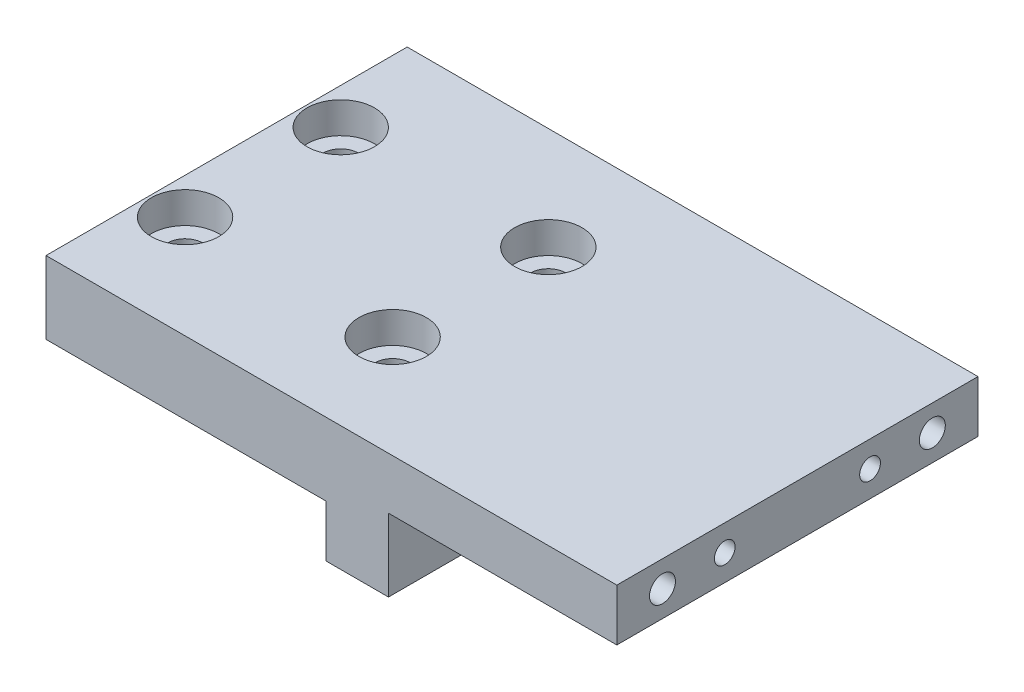
ISO-10303-21;
HEADER;
FILE_DESCRIPTION(('STEP AP214'),'2;1');
FILE_NAME('part.step','',(''),(''),'','','');
FILE_SCHEMA(('AUTOMOTIVE_DESIGN { 1 0 10303 214 1 1 1 1 }'));
ENDSEC;
DATA;
#1=APPLICATION_CONTEXT('core data for automotive mechanical design processes');
#2=APPLICATION_PROTOCOL_DEFINITION('international standard','automotive_design',2000,#1);
#3=PRODUCT_CONTEXT('',#1,'mechanical');
#4=PRODUCT('Part','Part','',(#3));
#5=PRODUCT_RELATED_PRODUCT_CATEGORY('part','',(#4));
#6=PRODUCT_DEFINITION_FORMATION('','',#4);
#7=PRODUCT_DEFINITION_CONTEXT('part definition',#1,'design');
#8=PRODUCT_DEFINITION('design','',#6,#7);
#9=PRODUCT_DEFINITION_SHAPE('','',#8);
#10=(LENGTH_UNIT() NAMED_UNIT(*) SI_UNIT(.MILLI.,.METRE.));
#11=(NAMED_UNIT(*) PLANE_ANGLE_UNIT() SI_UNIT($,.RADIAN.));
#12=(NAMED_UNIT(*) SI_UNIT($,.STERADIAN.) SOLID_ANGLE_UNIT());
#13=UNCERTAINTY_MEASURE_WITH_UNIT(LENGTH_MEASURE(1.E-05),#10,'distance_accuracy_value','');
#14=(GEOMETRIC_REPRESENTATION_CONTEXT(3) GLOBAL_UNCERTAINTY_ASSIGNED_CONTEXT((#13)) GLOBAL_UNIT_ASSIGNED_CONTEXT((#10,
#11,#12)) REPRESENTATION_CONTEXT('',''));
#15=CARTESIAN_POINT('',(0.,0.,0.));
#16=DIRECTION('',(0.,0.,1.));
#17=DIRECTION('',(1.,0.,0.));
#18=AXIS2_PLACEMENT_3D('',#15,#16,#17);
#19=CARTESIAN_POINT('',(3.5,-5.00100000000001,-24.9));
#20=DIRECTION('',(0.,1.,0.));
#21=DIRECTION('',(-1.,0.,0.));
#22=AXIS2_PLACEMENT_3D('',#19,#20,#21);
#23=CYLINDRICAL_SURFACE('',#22,1.7);
#24=CARTESIAN_POINT('',(3.5,0.,-24.9));
#25=DIRECTION('',(0.,-1.,0.));
#26=DIRECTION('',(0.,0.,-1.));
#27=AXIS2_PLACEMENT_3D('',#24,#25,#26);
#28=CIRCLE('',#27,1.7);
#29=CARTESIAN_POINT('',(3.5,0.,-26.6));
#30=VERTEX_POINT('',#29);
#31=EDGE_CURVE('E149',#30,#30,#28,.F.);
#32=ORIENTED_EDGE('',*,*,#31,.F.);
#33=EDGE_LOOP('',(#32));
#34=FACE_BOUND('',#33,.T.);
#35=CARTESIAN_POINT('',(3.5,4.,-24.9));
#36=DIRECTION('',(0.,1.,0.));
#37=DIRECTION('',(-1.,0.,0.));
#38=AXIS2_PLACEMENT_3D('',#35,#36,#37);
#39=CIRCLE('',#38,1.7);
#40=CARTESIAN_POINT('',(1.8,4.,-24.9));
#41=VERTEX_POINT('',#40);
#42=EDGE_CURVE('E43',#41,#41,#39,.F.);
#43=ORIENTED_EDGE('',*,*,#42,.F.);
#44=EDGE_LOOP('',(#43));
#45=FACE_BOUND('',#44,.T.);
#46=ADVANCED_FACE('F39',(#34,#45),#23,.F.);
#47=CARTESIAN_POINT('',(23.5,-5.00100000000001,-24.9));
#48=DIRECTION('',(0.,1.,0.));
#49=DIRECTION('',(-1.,0.,0.));
#50=AXIS2_PLACEMENT_3D('',#47,#48,#49);
#51=CYLINDRICAL_SURFACE('',#50,1.7);
#52=CARTESIAN_POINT('',(23.5,0.,-24.9));
#53=DIRECTION('',(0.,-1.,0.));
#54=DIRECTION('',(0.,0.,-1.));
#55=AXIS2_PLACEMENT_3D('',#52,#53,#54);
#56=CIRCLE('',#55,1.7);
#57=CARTESIAN_POINT('',(23.5,0.,-26.6));
#58=VERTEX_POINT('',#57);
#59=EDGE_CURVE('E254',#58,#58,#56,.F.);
#60=ORIENTED_EDGE('',*,*,#59,.F.);
#61=EDGE_LOOP('',(#60));
#62=FACE_BOUND('',#61,.T.);
#63=CARTESIAN_POINT('',(23.5,4.,-24.9));
#64=DIRECTION('',(0.,1.,0.));
#65=DIRECTION('',(-1.,0.,0.));
#66=AXIS2_PLACEMENT_3D('',#63,#64,#65);
#67=CIRCLE('',#66,1.7);
#68=CARTESIAN_POINT('',(21.8,4.,-24.9));
#69=VERTEX_POINT('',#68);
#70=EDGE_CURVE('E198',#69,#69,#67,.F.);
#71=ORIENTED_EDGE('',*,*,#70,.F.);
#72=EDGE_LOOP('',(#71));
#73=FACE_BOUND('',#72,.T.);
#74=ADVANCED_FACE('F305',(#62,#73),#51,.F.);
#75=CARTESIAN_POINT('',(23.5000000000002,-5.00100000000001,-9.9));
#76=DIRECTION('',(0.,1.,0.));
#77=DIRECTION('',(-1.,0.,0.));
#78=AXIS2_PLACEMENT_3D('',#75,#76,#77);
#79=CYLINDRICAL_SURFACE('',#78,1.7);
#80=CARTESIAN_POINT('',(23.5000000000002,0.,-9.9));
#81=DIRECTION('',(0.,-1.,0.));
#82=DIRECTION('',(0.,0.,-1.));
#83=AXIS2_PLACEMENT_3D('',#80,#81,#82);
#84=CIRCLE('',#83,1.7);
#85=CARTESIAN_POINT('',(23.5000000000002,0.,-11.6));
#86=VERTEX_POINT('',#85);
#87=EDGE_CURVE('E258',#86,#86,#84,.F.);
#88=ORIENTED_EDGE('',*,*,#87,.F.);
#89=EDGE_LOOP('',(#88));
#90=FACE_BOUND('',#89,.T.);
#91=CARTESIAN_POINT('',(23.5000000000002,4.,-9.9));
#92=DIRECTION('',(0.,1.,0.));
#93=DIRECTION('',(-1.,0.,0.));
#94=AXIS2_PLACEMENT_3D('',#91,#92,#93);
#95=CIRCLE('',#94,1.7);
#96=CARTESIAN_POINT('',(21.8000000000002,4.,-9.9));
#97=VERTEX_POINT('',#96);
#98=EDGE_CURVE('E194',#97,#97,#95,.F.);
#99=ORIENTED_EDGE('',*,*,#98,.F.);
#100=EDGE_LOOP('',(#99));
#101=FACE_BOUND('',#100,.T.);
#102=ADVANCED_FACE('F311',(#90,#101),#79,.F.);
#103=CARTESIAN_POINT('',(3.50000000000016,-5.00100000000001,-9.9));
#104=DIRECTION('',(0.,1.,0.));
#105=DIRECTION('',(-1.,0.,0.));
#106=AXIS2_PLACEMENT_3D('',#103,#104,#105);
#107=CYLINDRICAL_SURFACE('',#106,1.7);
#108=CARTESIAN_POINT('',(3.50000000000016,0.,-9.9));
#109=DIRECTION('',(0.,-1.,0.));
#110=DIRECTION('',(0.,0.,-1.));
#111=AXIS2_PLACEMENT_3D('',#108,#109,#110);
#112=CIRCLE('',#111,1.7);
#113=CARTESIAN_POINT('',(3.50000000000016,0.,-11.6));
#114=VERTEX_POINT('',#113);
#115=EDGE_CURVE('E247',#114,#114,#112,.F.);
#116=ORIENTED_EDGE('',*,*,#115,.F.);
#117=EDGE_LOOP('',(#116));
#118=FACE_BOUND('',#117,.T.);
#119=CARTESIAN_POINT('',(3.50000000000016,4.,-9.9));
#120=DIRECTION('',(0.,1.,0.));
#121=DIRECTION('',(-1.,0.,0.));
#122=AXIS2_PLACEMENT_3D('',#119,#120,#121);
#123=CIRCLE('',#122,1.7);
#124=CARTESIAN_POINT('',(1.80000000000016,4.,-9.9));
#125=VERTEX_POINT('',#124);
#126=EDGE_CURVE('E190',#125,#125,#123,.F.);
#127=ORIENTED_EDGE('',*,*,#126,.F.);
#128=EDGE_LOOP('',(#127));
#129=FACE_BOUND('',#128,.T.);
#130=ADVANCED_FACE('F300',(#118,#129),#107,.F.);
#131=CARTESIAN_POINT('',(0.,6.99999999999999,-34.8));
#132=DIRECTION('',(-1.,0.,0.));
#133=DIRECTION('',(0.,-1.,0.));
#134=AXIS2_PLACEMENT_3D('',#131,#132,#133);
#135=PLANE('',#134);
#136=DIRECTION('',(0.,-1.,0.));
#137=VECTOR('',#136,1.);
#138=CARTESIAN_POINT('',(0.,6.99999999999999,0.));
#139=LINE('',#138,#137);
#140=CARTESIAN_POINT('',(0.,6.99999999999999,0.));
#141=VERTEX_POINT('',#140);
#142=CARTESIAN_POINT('',(0.,0.,0.));
#143=VERTEX_POINT('',#142);
#144=EDGE_CURVE('E144',#141,#143,#139,.T.);
#145=ORIENTED_EDGE('',*,*,#144,.F.);
#146=DIRECTION('',(0.,0.,1.));
#147=VECTOR('',#146,1.);
#148=CARTESIAN_POINT('',(0.,6.99999999999999,-34.8));
#149=LINE('',#148,#147);
#150=CARTESIAN_POINT('',(0.,6.99999999999999,-34.8));
#151=VERTEX_POINT('',#150);
#152=EDGE_CURVE('E11',#151,#141,#149,.T.);
#153=ORIENTED_EDGE('',*,*,#152,.F.);
#154=DIRECTION('',(0.,-1.,0.));
#155=VECTOR('',#154,1.);
#156=CARTESIAN_POINT('',(0.,6.99999999999999,-34.8));
#157=LINE('',#156,#155);
#158=CARTESIAN_POINT('',(0.,0.,-34.8));
#159=VERTEX_POINT('',#158);
#160=EDGE_CURVE('E173',#151,#159,#157,.T.);
#161=ORIENTED_EDGE('',*,*,#160,.T.);
#162=DIRECTION('',(0.,0.,1.));
#163=VECTOR('',#162,1.);
#164=CARTESIAN_POINT('',(0.,0.,-34.8));
#165=LINE('',#164,#163);
#166=EDGE_CURVE('E97',#159,#143,#165,.T.);
#167=ORIENTED_EDGE('',*,*,#166,.T.);
#168=EDGE_LOOP('',(#145,#153,#161,#167));
#169=FACE_BOUND('',#168,.T.);
#170=ADVANCED_FACE('F41',(#169),#135,.T.);
#171=CARTESIAN_POINT('',(55.,7.,-34.8));
#172=DIRECTION('',(0.,1.,0.));
#173=DIRECTION('',(-1.,0.,0.));
#174=AXIS2_PLACEMENT_3D('',#171,#172,#173);
#175=PLANE('',#174);
#176=CARTESIAN_POINT('',(3.50000000000016,6.99999999999999,-9.9));
#177=DIRECTION('',(0.,1.,0.));
#178=DIRECTION('',(-1.,0.,0.));
#179=AXIS2_PLACEMENT_3D('',#176,#177,#178);
#180=CIRCLE('',#179,3.25);
#181=CARTESIAN_POINT('',(0.250000000000156,6.99999999999999,-9.9));
#182=VERTEX_POINT('',#181);
#183=EDGE_CURVE('E519',#182,#182,#180,.T.);
#184=ORIENTED_EDGE('',*,*,#183,.F.);
#185=EDGE_LOOP('',(#184));
#186=FACE_BOUND('',#185,.T.);
#187=CARTESIAN_POINT('',(23.5000000000002,7.,-9.9));
#188=DIRECTION('',(0.,1.,0.));
#189=DIRECTION('',(-1.,0.,0.));
#190=AXIS2_PLACEMENT_3D('',#187,#188,#189);
#191=CIRCLE('',#190,3.25);
#192=CARTESIAN_POINT('',(20.2500000000002,7.,-9.9));
#193=VERTEX_POINT('',#192);
#194=EDGE_CURVE('E509',#193,#193,#191,.T.);
#195=ORIENTED_EDGE('',*,*,#194,.F.);
#196=EDGE_LOOP('',(#195));
#197=FACE_BOUND('',#196,.T.);
#198=CARTESIAN_POINT('',(23.5,7.,-24.9));
#199=DIRECTION('',(0.,1.,0.));
#200=DIRECTION('',(-1.,0.,0.));
#201=AXIS2_PLACEMENT_3D('',#198,#199,#200);
#202=CIRCLE('',#201,3.25);
#203=CARTESIAN_POINT('',(20.25,7.,-24.9));
#204=VERTEX_POINT('',#203);
#205=EDGE_CURVE('E500',#204,#204,#202,.T.);
#206=ORIENTED_EDGE('',*,*,#205,.F.);
#207=EDGE_LOOP('',(#206));
#208=FACE_BOUND('',#207,.T.);
#209=CARTESIAN_POINT('',(3.5,6.99999999999999,-24.9));
#210=DIRECTION('',(0.,1.,0.));
#211=DIRECTION('',(-1.,0.,0.));
#212=AXIS2_PLACEMENT_3D('',#209,#210,#211);
#213=CIRCLE('',#212,3.25);
#214=CARTESIAN_POINT('',(0.25,6.99999999999999,-24.9));
#215=VERTEX_POINT('',#214);
#216=EDGE_CURVE('E507',#215,#215,#213,.T.);
#217=ORIENTED_EDGE('',*,*,#216,.F.);
#218=EDGE_LOOP('',(#217));
#219=FACE_BOUND('',#218,.T.);
#220=DIRECTION('',(-1.,0.,0.));
#221=VECTOR('',#220,1.);
#222=CARTESIAN_POINT('',(55.,7.,0.));
#223=LINE('',#222,#221);
#224=CARTESIAN_POINT('',(55.,7.,0.));
#225=VERTEX_POINT('',#224);
#226=EDGE_CURVE('E170',#225,#141,#223,.T.);
#227=ORIENTED_EDGE('',*,*,#226,.F.);
#228=DIRECTION('',(0.,0.,1.));
#229=VECTOR('',#228,1.);
#230=CARTESIAN_POINT('',(55.,7.,-34.8));
#231=LINE('',#230,#229);
#232=CARTESIAN_POINT('',(55.,7.,-34.8));
#233=VERTEX_POINT('',#232);
#234=EDGE_CURVE('E50',#233,#225,#231,.T.);
#235=ORIENTED_EDGE('',*,*,#234,.F.);
#236=DIRECTION('',(-1.,0.,0.));
#237=VECTOR('',#236,1.);
#238=CARTESIAN_POINT('',(55.,7.,-34.8));
#239=LINE('',#238,#237);
#240=EDGE_CURVE('E130',#233,#151,#239,.T.);
#241=ORIENTED_EDGE('',*,*,#240,.T.);
#242=ORIENTED_EDGE('',*,*,#152,.T.);
#243=EDGE_LOOP('',(#227,#235,#241,#242));
#244=FACE_BOUND('',#243,.T.);
#245=ADVANCED_FACE('F290',(#186,#197,#208,#219,#244),#175,.T.);
#246=CARTESIAN_POINT('',(55.,2.,-34.8));
#247=DIRECTION('',(1.,0.,0.));
#248=DIRECTION('',(0.,0.,-1.));
#249=AXIS2_PLACEMENT_3D('',#246,#247,#248);
#250=PLANE('',#249);
#251=CARTESIAN_POINT('',(55.,4.5,-10.4));
#252=DIRECTION('',(1.,0.,0.));
#253=DIRECTION('',(0.,0.,-1.));
#254=AXIS2_PLACEMENT_3D('',#251,#252,#253);
#255=CIRCLE('',#254,1.);
#256=CARTESIAN_POINT('',(55.,4.5,-11.4));
#257=VERTEX_POINT('',#256);
#258=EDGE_CURVE('E216',#257,#257,#255,.T.);
#259=ORIENTED_EDGE('',*,*,#258,.F.);
#260=EDGE_LOOP('',(#259));
#261=FACE_BOUND('',#260,.T.);
#262=CARTESIAN_POINT('',(55.,4.5,-24.4));
#263=DIRECTION('',(1.,0.,0.));
#264=DIRECTION('',(0.,0.,1.));
#265=AXIS2_PLACEMENT_3D('',#262,#263,#264);
#266=CIRCLE('',#265,1.);
#267=CARTESIAN_POINT('',(55.,4.5,-23.4));
#268=VERTEX_POINT('',#267);
#269=EDGE_CURVE('E205',#268,#268,#266,.T.);
#270=ORIENTED_EDGE('',*,*,#269,.F.);
#271=EDGE_LOOP('',(#270));
#272=FACE_BOUND('',#271,.T.);
#273=CARTESIAN_POINT('',(55.,4.5,-4.4));
#274=DIRECTION('',(1.,0.,0.));
#275=DIRECTION('',(0.,0.,-1.));
#276=AXIS2_PLACEMENT_3D('',#273,#274,#275);
#277=CIRCLE('',#276,1.25);
#278=CARTESIAN_POINT('',(55.,4.5,-5.65));
#279=VERTEX_POINT('',#278);
#280=EDGE_CURVE('E225',#279,#279,#277,.T.);
#281=ORIENTED_EDGE('',*,*,#280,.F.);
#282=EDGE_LOOP('',(#281));
#283=FACE_BOUND('',#282,.T.);
#284=CARTESIAN_POINT('',(55.,4.5,-30.4));
#285=DIRECTION('',(1.,0.,0.));
#286=DIRECTION('',(0.,0.,1.));
#287=AXIS2_PLACEMENT_3D('',#284,#285,#286);
#288=CIRCLE('',#287,1.25);
#289=CARTESIAN_POINT('',(55.,4.5,-29.15));
#290=VERTEX_POINT('',#289);
#291=EDGE_CURVE('E233',#290,#290,#288,.T.);
#292=ORIENTED_EDGE('',*,*,#291,.F.);
#293=EDGE_LOOP('',(#292));
#294=FACE_BOUND('',#293,.T.);
#295=DIRECTION('',(0.,1.,0.));
#296=VECTOR('',#295,1.);
#297=CARTESIAN_POINT('',(55.,2.,0.));
#298=LINE('',#297,#296);
#299=CARTESIAN_POINT('',(55.,2.,0.));
#300=VERTEX_POINT('',#299);
#301=EDGE_CURVE('E116',#300,#225,#298,.T.);
#302=ORIENTED_EDGE('',*,*,#301,.F.);
#303=DIRECTION('',(0.,0.,1.));
#304=VECTOR('',#303,1.);
#305=CARTESIAN_POINT('',(55.,2.,-34.8));
#306=LINE('',#305,#304);
#307=CARTESIAN_POINT('',(55.,2.,-34.8));
#308=VERTEX_POINT('',#307);
#309=EDGE_CURVE('E111',#308,#300,#306,.T.);
#310=ORIENTED_EDGE('',*,*,#309,.F.);
#311=DIRECTION('',(0.,1.,0.));
#312=VECTOR('',#311,1.);
#313=CARTESIAN_POINT('',(55.,2.,-34.8));
#314=LINE('',#313,#312);
#315=EDGE_CURVE('E114',#308,#233,#314,.T.);
#316=ORIENTED_EDGE('',*,*,#315,.T.);
#317=ORIENTED_EDGE('',*,*,#234,.T.);
#318=EDGE_LOOP('',(#302,#310,#316,#317));
#319=FACE_BOUND('',#318,.T.);
#320=ADVANCED_FACE('F113',(#261,#272,#283,#294,#319),#250,.T.);
#321=CARTESIAN_POINT('',(33.,2.,-34.8));
#322=DIRECTION('',(0.,-1.,0.));
#323=DIRECTION('',(0.,0.,-1.));
#324=AXIS2_PLACEMENT_3D('',#321,#322,#323);
#325=PLANE('',#324);
#326=DIRECTION('',(1.,0.,0.));
#327=VECTOR('',#326,1.);
#328=CARTESIAN_POINT('',(33.,2.,0.));
#329=LINE('',#328,#327);
#330=CARTESIAN_POINT('',(33.,2.,0.));
#331=VERTEX_POINT('',#330);
#332=EDGE_CURVE('E165',#331,#300,#329,.T.);
#333=ORIENTED_EDGE('',*,*,#332,.F.);
#334=DIRECTION('',(0.,0.,1.));
#335=VECTOR('',#334,1.);
#336=CARTESIAN_POINT('',(33.,2.,-34.8));
#337=LINE('',#336,#335);
#338=CARTESIAN_POINT('',(33.,2.,-34.8));
#339=VERTEX_POINT('',#338);
#340=EDGE_CURVE('E122',#339,#331,#337,.T.);
#341=ORIENTED_EDGE('',*,*,#340,.F.);
#342=DIRECTION('',(1.,0.,0.));
#343=VECTOR('',#342,1.);
#344=CARTESIAN_POINT('',(33.,2.,-34.8));
#345=LINE('',#344,#343);
#346=EDGE_CURVE('E128',#339,#308,#345,.T.);
#347=ORIENTED_EDGE('',*,*,#346,.T.);
#348=ORIENTED_EDGE('',*,*,#309,.T.);
#349=EDGE_LOOP('',(#333,#341,#347,#348));
#350=FACE_BOUND('',#349,.T.);
#351=ADVANCED_FACE('F133',(#350),#325,.T.);
#352=CARTESIAN_POINT('',(33.,-5.,-34.8));
#353=DIRECTION('',(1.,0.,0.));
#354=DIRECTION('',(0.,0.,-1.));
#355=AXIS2_PLACEMENT_3D('',#352,#353,#354);
#356=PLANE('',#355);
#357=CARTESIAN_POINT('',(33.,-1.,-8.9));
#358=DIRECTION('',(1.,0.,0.));
#359=DIRECTION('',(0.,0.,-1.));
#360=AXIS2_PLACEMENT_3D('',#357,#358,#359);
#361=CIRCLE('',#360,0.800000000000001);
#362=CARTESIAN_POINT('',(33.,-1.,-9.7));
#363=VERTEX_POINT('',#362);
#364=EDGE_CURVE('E238',#363,#363,#361,.T.);
#365=ORIENTED_EDGE('',*,*,#364,.F.);
#366=EDGE_LOOP('',(#365));
#367=FACE_BOUND('',#366,.T.);
#368=CARTESIAN_POINT('',(33.,-1.,-25.9));
#369=DIRECTION('',(1.,0.,0.));
#370=DIRECTION('',(0.,0.,1.));
#371=AXIS2_PLACEMENT_3D('',#368,#369,#370);
#372=CIRCLE('',#371,0.800000000000003);
#373=CARTESIAN_POINT('',(33.,-1.,-25.1));
#374=VERTEX_POINT('',#373);
#375=EDGE_CURVE('E224',#374,#374,#372,.T.);
#376=ORIENTED_EDGE('',*,*,#375,.F.);
#377=EDGE_LOOP('',(#376));
#378=FACE_BOUND('',#377,.T.);
#379=DIRECTION('',(0.,1.,0.));
#380=VECTOR('',#379,1.);
#381=CARTESIAN_POINT('',(33.,-5.,0.));
#382=LINE('',#381,#380);
#383=CARTESIAN_POINT('',(33.,-5.,0.));
#384=VERTEX_POINT('',#383);
#385=EDGE_CURVE('E161',#384,#331,#382,.T.);
#386=ORIENTED_EDGE('',*,*,#385,.F.);
#387=DIRECTION('',(0.,0.,1.));
#388=VECTOR('',#387,1.);
#389=CARTESIAN_POINT('',(33.,-5.,-34.8));
#390=LINE('',#389,#388);
#391=CARTESIAN_POINT('',(33.,-5.,-34.8));
#392=VERTEX_POINT('',#391);
#393=EDGE_CURVE('E179',#392,#384,#390,.T.);
#394=ORIENTED_EDGE('',*,*,#393,.F.);
#395=DIRECTION('',(0.,1.,0.));
#396=VECTOR('',#395,1.);
#397=CARTESIAN_POINT('',(33.,-5.,-34.8));
#398=LINE('',#397,#396);
#399=EDGE_CURVE('E135',#392,#339,#398,.T.);
#400=ORIENTED_EDGE('',*,*,#399,.T.);
#401=ORIENTED_EDGE('',*,*,#340,.T.);
#402=EDGE_LOOP('',(#386,#394,#400,#401));
#403=FACE_BOUND('',#402,.T.);
#404=ADVANCED_FACE('F627',(#367,#378,#403),#356,.T.);
#405=CARTESIAN_POINT('',(27.,-5.,-34.8));
#406=DIRECTION('',(0.,-1.,0.));
#407=DIRECTION('',(1.,0.,0.));
#408=AXIS2_PLACEMENT_3D('',#405,#406,#407);
#409=PLANE('',#408);
#410=DIRECTION('',(1.,0.,0.));
#411=VECTOR('',#410,1.);
#412=CARTESIAN_POINT('',(27.,-5.,0.));
#413=LINE('',#412,#411);
#414=CARTESIAN_POINT('',(27.,-5.,0.));
#415=VERTEX_POINT('',#414);
#416=EDGE_CURVE('E157',#415,#384,#413,.T.);
#417=ORIENTED_EDGE('',*,*,#416,.F.);
#418=DIRECTION('',(0.,0.,1.));
#419=VECTOR('',#418,1.);
#420=CARTESIAN_POINT('',(27.,-5.,-34.8));
#421=LINE('',#420,#419);
#422=CARTESIAN_POINT('',(27.,-5.,-34.8));
#423=VERTEX_POINT('',#422);
#424=EDGE_CURVE('E182',#423,#415,#421,.T.);
#425=ORIENTED_EDGE('',*,*,#424,.F.);
#426=DIRECTION('',(1.,0.,0.));
#427=VECTOR('',#426,1.);
#428=CARTESIAN_POINT('',(27.,-5.,-34.8));
#429=LINE('',#428,#427);
#430=EDGE_CURVE('E138',#423,#392,#429,.T.);
#431=ORIENTED_EDGE('',*,*,#430,.T.);
#432=ORIENTED_EDGE('',*,*,#393,.T.);
#433=EDGE_LOOP('',(#417,#425,#431,#432));
#434=FACE_BOUND('',#433,.T.);
#435=ADVANCED_FACE('F281',(#434),#409,.T.);
#436=CARTESIAN_POINT('',(27.,-5.,-34.8));
#437=DIRECTION('',(-1.,0.,0.));
#438=DIRECTION('',(0.,0.,1.));
#439=AXIS2_PLACEMENT_3D('',#436,#437,#438);
#440=PLANE('',#439);
#441=CARTESIAN_POINT('',(27.,-1.,-8.9));
#442=DIRECTION('',(-1.,0.,0.));
#443=DIRECTION('',(0.,0.,1.));
#444=AXIS2_PLACEMENT_3D('',#441,#442,#443);
#445=CIRCLE('',#444,0.800000000000001);
#446=CARTESIAN_POINT('',(27.,-1.,-8.1));
#447=VERTEX_POINT('',#446);
#448=EDGE_CURVE('E242',#447,#447,#445,.F.);
#449=ORIENTED_EDGE('',*,*,#448,.T.);
#450=EDGE_LOOP('',(#449));
#451=FACE_BOUND('',#450,.T.);
#452=CARTESIAN_POINT('',(27.,-1.,-25.9));
#453=DIRECTION('',(-1.,0.,0.));
#454=DIRECTION('',(0.,0.,1.));
#455=AXIS2_PLACEMENT_3D('',#452,#453,#454);
#456=CIRCLE('',#455,0.800000000000003);
#457=CARTESIAN_POINT('',(27.,-1.,-25.1));
#458=VERTEX_POINT('',#457);
#459=EDGE_CURVE('E243',#458,#458,#456,.F.);
#460=ORIENTED_EDGE('',*,*,#459,.T.);
#461=EDGE_LOOP('',(#460));
#462=FACE_BOUND('',#461,.T.);
#463=DIRECTION('',(0.,-1.,0.));
#464=VECTOR('',#463,1.);
#465=CARTESIAN_POINT('',(27.,-5.,0.));
#466=LINE('',#465,#464);
#467=CARTESIAN_POINT('',(27.,0.,0.));
#468=VERTEX_POINT('',#467);
#469=EDGE_CURVE('E153',#468,#415,#466,.T.);
#470=ORIENTED_EDGE('',*,*,#469,.F.);
#471=DIRECTION('',(0.,0.,1.));
#472=VECTOR('',#471,1.);
#473=CARTESIAN_POINT('',(27.,0.,-34.8));
#474=LINE('',#473,#472);
#475=CARTESIAN_POINT('',(27.,0.,-34.8));
#476=VERTEX_POINT('',#475);
#477=EDGE_CURVE('E185',#476,#468,#474,.T.);
#478=ORIENTED_EDGE('',*,*,#477,.F.);
#479=DIRECTION('',(0.,-1.,0.));
#480=VECTOR('',#479,1.);
#481=CARTESIAN_POINT('',(27.,-5.,-34.8));
#482=LINE('',#481,#480);
#483=EDGE_CURVE('E273',#476,#423,#482,.T.);
#484=ORIENTED_EDGE('',*,*,#483,.T.);
#485=ORIENTED_EDGE('',*,*,#424,.T.);
#486=EDGE_LOOP('',(#470,#478,#484,#485));
#487=FACE_BOUND('',#486,.T.);
#488=ADVANCED_FACE('F286',(#451,#462,#487),#440,.T.);
#489=CARTESIAN_POINT('',(0.,0.,-34.8));
#490=DIRECTION('',(0.,-1.,0.));
#491=DIRECTION('',(0.,0.,-1.));
#492=AXIS2_PLACEMENT_3D('',#489,#490,#491);
#493=PLANE('',#492);
#494=ORIENTED_EDGE('',*,*,#115,.T.);
#495=EDGE_LOOP('',(#494));
#496=FACE_BOUND('',#495,.T.);
#497=ORIENTED_EDGE('',*,*,#87,.T.);
#498=EDGE_LOOP('',(#497));
#499=FACE_BOUND('',#498,.T.);
#500=ORIENTED_EDGE('',*,*,#59,.T.);
#501=EDGE_LOOP('',(#500));
#502=FACE_BOUND('',#501,.T.);
#503=ORIENTED_EDGE('',*,*,#31,.T.);
#504=EDGE_LOOP('',(#503));
#505=FACE_BOUND('',#504,.T.);
#506=DIRECTION('',(1.,0.,0.));
#507=VECTOR('',#506,1.);
#508=CARTESIAN_POINT('',(0.,0.,0.));
#509=LINE('',#508,#507);
#510=EDGE_CURVE('E148',#143,#468,#509,.T.);
#511=ORIENTED_EDGE('',*,*,#510,.F.);
#512=ORIENTED_EDGE('',*,*,#166,.F.);
#513=DIRECTION('',(1.,0.,0.));
#514=VECTOR('',#513,1.);
#515=CARTESIAN_POINT('',(0.,0.,-34.8));
#516=LINE('',#515,#514);
#517=EDGE_CURVE('E270',#159,#476,#516,.T.);
#518=ORIENTED_EDGE('',*,*,#517,.T.);
#519=ORIENTED_EDGE('',*,*,#477,.T.);
#520=EDGE_LOOP('',(#511,#512,#518,#519));
#521=FACE_BOUND('',#520,.T.);
#522=ADVANCED_FACE('F287',(#496,#499,#502,#505,#521),#493,.T.);
#523=CARTESIAN_POINT('',(0.,0.,-34.8));
#524=DIRECTION('',(0.,0.,1.));
#525=DIRECTION('',(1.,0.,0.));
#526=AXIS2_PLACEMENT_3D('',#523,#524,#525);
#527=PLANE('',#526);
#528=ORIENTED_EDGE('',*,*,#160,.F.);
#529=ORIENTED_EDGE('',*,*,#240,.F.);
#530=ORIENTED_EDGE('',*,*,#315,.F.);
#531=ORIENTED_EDGE('',*,*,#346,.F.);
#532=ORIENTED_EDGE('',*,*,#399,.F.);
#533=ORIENTED_EDGE('',*,*,#430,.F.);
#534=ORIENTED_EDGE('',*,*,#483,.F.);
#535=ORIENTED_EDGE('',*,*,#517,.F.);
#536=EDGE_LOOP('',(#528,#529,#530,#531,#532,#533,#534,#535));
#537=FACE_BOUND('',#536,.T.);
#538=ADVANCED_FACE('F126',(#537),#527,.F.);
#539=CARTESIAN_POINT('',(0.,0.,0.));
#540=DIRECTION('',(0.,0.,1.));
#541=DIRECTION('',(1.,0.,0.));
#542=AXIS2_PLACEMENT_3D('',#539,#540,#541);
#543=PLANE('',#542);
#544=ORIENTED_EDGE('',*,*,#144,.T.);
#545=ORIENTED_EDGE('',*,*,#510,.T.);
#546=ORIENTED_EDGE('',*,*,#469,.T.);
#547=ORIENTED_EDGE('',*,*,#416,.T.);
#548=ORIENTED_EDGE('',*,*,#385,.T.);
#549=ORIENTED_EDGE('',*,*,#332,.T.);
#550=ORIENTED_EDGE('',*,*,#301,.T.);
#551=ORIENTED_EDGE('',*,*,#226,.T.);
#552=EDGE_LOOP('',(#544,#545,#546,#547,#548,#549,#550,#551));
#553=FACE_BOUND('',#552,.T.);
#554=ADVANCED_FACE('F289',(#553),#543,.T.);
#555=CARTESIAN_POINT('',(24.737258300203,-1.,-25.9));
#556=DIRECTION('',(1.,0.,0.));
#557=DIRECTION('',(0.,0.,-1.));
#558=AXIS2_PLACEMENT_3D('',#555,#556,#557);
#559=CYLINDRICAL_SURFACE('',#558,0.800000000000003);
#560=ORIENTED_EDGE('',*,*,#375,.T.);
#561=EDGE_LOOP('',(#560));
#562=FACE_BOUND('',#561,.T.);
#563=ORIENTED_EDGE('',*,*,#459,.F.);
#564=EDGE_LOOP('',(#563));
#565=FACE_BOUND('',#564,.T.);
#566=ADVANCED_FACE('F321',(#562,#565),#559,.F.);
#567=CARTESIAN_POINT('',(24.737258300203,-1.,-8.9));
#568=DIRECTION('',(1.,0.,0.));
#569=DIRECTION('',(0.,0.,-1.));
#570=AXIS2_PLACEMENT_3D('',#567,#568,#569);
#571=CYLINDRICAL_SURFACE('',#570,0.800000000000001);
#572=ORIENTED_EDGE('',*,*,#364,.T.);
#573=EDGE_LOOP('',(#572));
#574=FACE_BOUND('',#573,.T.);
#575=ORIENTED_EDGE('',*,*,#448,.F.);
#576=EDGE_LOOP('',(#575));
#577=FACE_BOUND('',#576,.T.);
#578=ADVANCED_FACE('F325',(#574,#577),#571,.F.);
#579=CARTESIAN_POINT('',(45.,4.5,-30.4));
#580=DIRECTION('',(1.,0.,0.));
#581=DIRECTION('',(0.,0.,-1.));
#582=AXIS2_PLACEMENT_3D('',#579,#580,#581);
#583=CYLINDRICAL_SURFACE('',#582,1.25);
#584=CARTESIAN_POINT('',(45.,4.5,-30.4));
#585=DIRECTION('',(1.,0.,0.));
#586=DIRECTION('',(0.,0.,1.));
#587=AXIS2_PLACEMENT_3D('',#584,#585,#586);
#588=CIRCLE('',#587,1.25);
#589=CARTESIAN_POINT('',(45.,4.5,-29.15));
#590=VERTEX_POINT('',#589);
#591=EDGE_CURVE('E229',#590,#590,#588,.T.);
#592=ORIENTED_EDGE('',*,*,#591,.F.);
#593=EDGE_LOOP('',(#592));
#594=FACE_BOUND('',#593,.T.);
#595=ORIENTED_EDGE('',*,*,#291,.T.);
#596=EDGE_LOOP('',(#595));
#597=FACE_BOUND('',#596,.T.);
#598=ADVANCED_FACE('F331',(#594,#597),#583,.F.);
#599=CARTESIAN_POINT('',(45.,4.5,-30.4));
#600=DIRECTION('',(-1.,0.,0.));
#601=DIRECTION('',(0.,0.,1.));
#602=AXIS2_PLACEMENT_3D('',#599,#600,#601);
#603=PLANE('',#602);
#604=ORIENTED_EDGE('',*,*,#591,.T.);
#605=EDGE_LOOP('',(#604));
#606=FACE_BOUND('',#605,.T.);
#607=ADVANCED_FACE('F401',(#606),#603,.F.);
#608=CARTESIAN_POINT('',(45.,4.5,-4.4));
#609=DIRECTION('',(1.,0.,0.));
#610=DIRECTION('',(0.,0.,-1.));
#611=AXIS2_PLACEMENT_3D('',#608,#609,#610);
#612=CYLINDRICAL_SURFACE('',#611,1.25);
#613=CARTESIAN_POINT('',(45.,4.5,-4.4));
#614=DIRECTION('',(1.,0.,0.));
#615=DIRECTION('',(0.,0.,-1.));
#616=AXIS2_PLACEMENT_3D('',#613,#614,#615);
#617=CIRCLE('',#616,1.25);
#618=CARTESIAN_POINT('',(45.,4.5,-5.65));
#619=VERTEX_POINT('',#618);
#620=EDGE_CURVE('E220',#619,#619,#617,.T.);
#621=ORIENTED_EDGE('',*,*,#620,.F.);
#622=EDGE_LOOP('',(#621));
#623=FACE_BOUND('',#622,.T.);
#624=ORIENTED_EDGE('',*,*,#280,.T.);
#625=EDGE_LOOP('',(#624));
#626=FACE_BOUND('',#625,.T.);
#627=ADVANCED_FACE('F397',(#623,#626),#612,.F.);
#628=CARTESIAN_POINT('',(45.,4.5,-4.4));
#629=DIRECTION('',(1.,0.,0.));
#630=DIRECTION('',(0.,0.,-1.));
#631=AXIS2_PLACEMENT_3D('',#628,#629,#630);
#632=PLANE('',#631);
#633=ORIENTED_EDGE('',*,*,#620,.T.);
#634=EDGE_LOOP('',(#633));
#635=FACE_BOUND('',#634,.T.);
#636=ADVANCED_FACE('F393',(#635),#632,.T.);
#637=CARTESIAN_POINT('',(51.,4.5,-24.4));
#638=DIRECTION('',(1.,0.,0.));
#639=DIRECTION('',(0.,0.,-1.));
#640=AXIS2_PLACEMENT_3D('',#637,#638,#639);
#641=CYLINDRICAL_SURFACE('',#640,1.);
#642=CARTESIAN_POINT('',(51.,4.5,-24.4));
#643=DIRECTION('',(1.,0.,0.));
#644=DIRECTION('',(0.,0.,1.));
#645=AXIS2_PLACEMENT_3D('',#642,#643,#644);
#646=CIRCLE('',#645,1.);
#647=CARTESIAN_POINT('',(51.,4.5,-23.4));
#648=VERTEX_POINT('',#647);
#649=EDGE_CURVE('E210',#648,#648,#646,.T.);
#650=ORIENTED_EDGE('',*,*,#649,.F.);
#651=EDGE_LOOP('',(#650));
#652=FACE_BOUND('',#651,.T.);
#653=ORIENTED_EDGE('',*,*,#269,.T.);
#654=EDGE_LOOP('',(#653));
#655=FACE_BOUND('',#654,.T.);
#656=ADVANCED_FACE('F389',(#652,#655),#641,.F.);
#657=CARTESIAN_POINT('',(51.,4.5,-24.4));
#658=DIRECTION('',(-1.,0.,0.));
#659=DIRECTION('',(0.,0.,1.));
#660=AXIS2_PLACEMENT_3D('',#657,#658,#659);
#661=PLANE('',#660);
#662=ORIENTED_EDGE('',*,*,#649,.T.);
#663=EDGE_LOOP('',(#662));
#664=FACE_BOUND('',#663,.T.);
#665=ADVANCED_FACE('F385',(#664),#661,.F.);
#666=CARTESIAN_POINT('',(51.,4.5,-10.4));
#667=DIRECTION('',(1.,0.,0.));
#668=DIRECTION('',(0.,0.,-1.));
#669=AXIS2_PLACEMENT_3D('',#666,#667,#668);
#670=CYLINDRICAL_SURFACE('',#669,1.);
#671=CARTESIAN_POINT('',(51.,4.5,-10.4));
#672=DIRECTION('',(1.,0.,0.));
#673=DIRECTION('',(0.,0.,-1.));
#674=AXIS2_PLACEMENT_3D('',#671,#672,#673);
#675=CIRCLE('',#674,1.);
#676=CARTESIAN_POINT('',(51.,4.5,-11.4));
#677=VERTEX_POINT('',#676);
#678=EDGE_CURVE('E237',#677,#677,#675,.T.);
#679=ORIENTED_EDGE('',*,*,#678,.F.);
#680=EDGE_LOOP('',(#679));
#681=FACE_BOUND('',#680,.T.);
#682=ORIENTED_EDGE('',*,*,#258,.T.);
#683=EDGE_LOOP('',(#682));
#684=FACE_BOUND('',#683,.T.);
#685=ADVANCED_FACE('F381',(#681,#684),#670,.F.);
#686=CARTESIAN_POINT('',(51.,4.5,-10.4));
#687=DIRECTION('',(1.,0.,0.));
#688=DIRECTION('',(0.,0.,-1.));
#689=AXIS2_PLACEMENT_3D('',#686,#687,#688);
#690=PLANE('',#689);
#691=ORIENTED_EDGE('',*,*,#678,.T.);
#692=EDGE_LOOP('',(#691));
#693=FACE_BOUND('',#692,.T.);
#694=ADVANCED_FACE('F368',(#693),#690,.T.);
#695=CARTESIAN_POINT('',(3.50000000000016,3.99999999999999,-9.9));
#696=DIRECTION('',(0.,1.,0.));
#697=DIRECTION('',(-1.,0.,0.));
#698=AXIS2_PLACEMENT_3D('',#695,#696,#697);
#699=PLANE('',#698);
#700=CARTESIAN_POINT('',(3.50000000000016,3.99999999999999,-9.9));
#701=DIRECTION('',(0.,1.,0.));
#702=DIRECTION('',(-1.,0.,0.));
#703=AXIS2_PLACEMENT_3D('',#700,#701,#702);
#704=CIRCLE('',#703,3.25);
#705=CARTESIAN_POINT('',(0.250000000000157,3.99999999999999,-9.9));
#706=VERTEX_POINT('',#705);
#707=EDGE_CURVE('E515',#706,#706,#704,.T.);
#708=ORIENTED_EDGE('',*,*,#707,.T.);
#709=EDGE_LOOP('',(#708));
#710=FACE_BOUND('',#709,.T.);
#711=ORIENTED_EDGE('',*,*,#126,.T.);
#712=EDGE_LOOP('',(#711));
#713=FACE_BOUND('',#712,.T.);
#714=ADVANCED_FACE('F359',(#710,#713),#699,.T.);
#715=CARTESIAN_POINT('',(3.50000000000016,3.99999999999999,-9.9));
#716=DIRECTION('',(0.,1.,0.));
#717=DIRECTION('',(-1.,0.,0.));
#718=AXIS2_PLACEMENT_3D('',#715,#716,#717);
#719=CYLINDRICAL_SURFACE('',#718,3.25);
#720=ORIENTED_EDGE('',*,*,#707,.F.);
#721=EDGE_LOOP('',(#720));
#722=FACE_BOUND('',#721,.T.);
#723=ORIENTED_EDGE('',*,*,#183,.T.);
#724=EDGE_LOOP('',(#723));
#725=FACE_BOUND('',#724,.T.);
#726=ADVANCED_FACE('F349',(#722,#725),#719,.F.);
#727=CARTESIAN_POINT('',(23.5000000000002,4.,-9.9));
#728=DIRECTION('',(0.,1.,0.));
#729=DIRECTION('',(-1.,0.,0.));
#730=AXIS2_PLACEMENT_3D('',#727,#728,#729);
#731=PLANE('',#730);
#732=CARTESIAN_POINT('',(23.5000000000002,4.,-9.9));
#733=DIRECTION('',(0.,1.,0.));
#734=DIRECTION('',(-1.,0.,0.));
#735=AXIS2_PLACEMENT_3D('',#732,#733,#734);
#736=CIRCLE('',#735,3.25);
#737=CARTESIAN_POINT('',(20.2500000000002,4.,-9.9));
#738=VERTEX_POINT('',#737);
#739=EDGE_CURVE('E503',#738,#738,#736,.T.);
#740=ORIENTED_EDGE('',*,*,#739,.T.);
#741=EDGE_LOOP('',(#740));
#742=FACE_BOUND('',#741,.T.);
#743=ORIENTED_EDGE('',*,*,#98,.T.);
#744=EDGE_LOOP('',(#743));
#745=FACE_BOUND('',#744,.T.);
#746=ADVANCED_FACE('F346',(#742,#745),#731,.T.);
#747=CARTESIAN_POINT('',(23.5000000000002,4.,-9.9));
#748=DIRECTION('',(0.,1.,0.));
#749=DIRECTION('',(-1.,0.,0.));
#750=AXIS2_PLACEMENT_3D('',#747,#748,#749);
#751=CYLINDRICAL_SURFACE('',#750,3.25);
#752=ORIENTED_EDGE('',*,*,#739,.F.);
#753=EDGE_LOOP('',(#752));
#754=FACE_BOUND('',#753,.T.);
#755=ORIENTED_EDGE('',*,*,#194,.T.);
#756=EDGE_LOOP('',(#755));
#757=FACE_BOUND('',#756,.T.);
#758=ADVANCED_FACE('F348',(#754,#757),#751,.F.);
#759=CARTESIAN_POINT('',(23.5,4.,-24.9));
#760=DIRECTION('',(0.,1.,0.));
#761=DIRECTION('',(-1.,0.,0.));
#762=AXIS2_PLACEMENT_3D('',#759,#760,#761);
#763=PLANE('',#762);
#764=CARTESIAN_POINT('',(23.5,4.,-24.9));
#765=DIRECTION('',(0.,1.,0.));
#766=DIRECTION('',(-1.,0.,0.));
#767=AXIS2_PLACEMENT_3D('',#764,#765,#766);
#768=CIRCLE('',#767,3.25);
#769=CARTESIAN_POINT('',(20.25,4.,-24.9));
#770=VERTEX_POINT('',#769);
#771=EDGE_CURVE('E497',#770,#770,#768,.T.);
#772=ORIENTED_EDGE('',*,*,#771,.T.);
#773=EDGE_LOOP('',(#772));
#774=FACE_BOUND('',#773,.T.);
#775=ORIENTED_EDGE('',*,*,#70,.T.);
#776=EDGE_LOOP('',(#775));
#777=FACE_BOUND('',#776,.T.);
#778=ADVANCED_FACE('F356',(#774,#777),#763,.T.);
#779=CARTESIAN_POINT('',(23.5,4.,-24.9));
#780=DIRECTION('',(0.,1.,0.));
#781=DIRECTION('',(-1.,0.,0.));
#782=AXIS2_PLACEMENT_3D('',#779,#780,#781);
#783=CYLINDRICAL_SURFACE('',#782,3.25);
#784=ORIENTED_EDGE('',*,*,#771,.F.);
#785=EDGE_LOOP('',(#784));
#786=FACE_BOUND('',#785,.T.);
#787=ORIENTED_EDGE('',*,*,#205,.T.);
#788=EDGE_LOOP('',(#787));
#789=FACE_BOUND('',#788,.T.);
#790=ADVANCED_FACE('F364',(#786,#789),#783,.F.);
#791=CARTESIAN_POINT('',(3.5,3.99999999999999,-24.9));
#792=DIRECTION('',(0.,1.,0.));
#793=DIRECTION('',(-1.,0.,0.));
#794=AXIS2_PLACEMENT_3D('',#791,#792,#793);
#795=PLANE('',#794);
#796=CARTESIAN_POINT('',(3.5,3.99999999999999,-24.9));
#797=DIRECTION('',(0.,1.,0.));
#798=DIRECTION('',(-1.,0.,0.));
#799=AXIS2_PLACEMENT_3D('',#796,#797,#798);
#800=CIRCLE('',#799,3.25);
#801=CARTESIAN_POINT('',(0.250000000000001,3.99999999999999,-24.9));
#802=VERTEX_POINT('',#801);
#803=EDGE_CURVE('E195',#802,#802,#800,.T.);
#804=ORIENTED_EDGE('',*,*,#803,.T.);
#805=EDGE_LOOP('',(#804));
#806=FACE_BOUND('',#805,.T.);
#807=ORIENTED_EDGE('',*,*,#42,.T.);
#808=EDGE_LOOP('',(#807));
#809=FACE_BOUND('',#808,.T.);
#810=ADVANCED_FACE('F371',(#806,#809),#795,.T.);
#811=CARTESIAN_POINT('',(3.5,3.99999999999999,-24.9));
#812=DIRECTION('',(0.,1.,0.));
#813=DIRECTION('',(-1.,0.,0.));
#814=AXIS2_PLACEMENT_3D('',#811,#812,#813);
#815=CYLINDRICAL_SURFACE('',#814,3.25);
#816=ORIENTED_EDGE('',*,*,#803,.F.);
#817=EDGE_LOOP('',(#816));
#818=FACE_BOUND('',#817,.T.);
#819=ORIENTED_EDGE('',*,*,#216,.T.);
#820=EDGE_LOOP('',(#819));
#821=FACE_BOUND('',#820,.T.);
#822=ADVANCED_FACE('F374',(#818,#821),#815,.F.);
#823=CLOSED_SHELL('',(#46,#74,#102,#130,#170,#245,#320,#351,#404,#435,#488,#522,#538,#554,#566,
#578,#598,#607,#627,#636,#656,#665,#685,#694,#714,#726,#746,#758,#778,#790,#810,#822));
#824=MANIFOLD_SOLID_BREP('B2',#823);
#825=ADVANCED_BREP_SHAPE_REPRESENTATION('',(#18,#824),#14);
#826=SHAPE_DEFINITION_REPRESENTATION(#9,#825);
ENDSEC;
END-ISO-10303-21;
